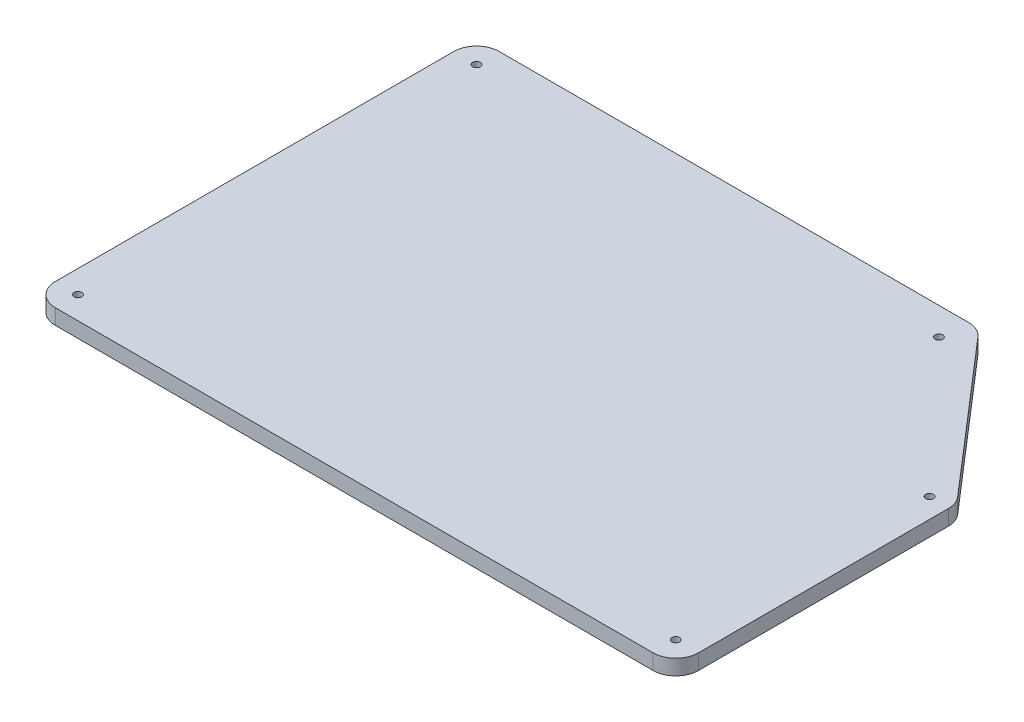
ISO-10303-21;
HEADER;
FILE_DESCRIPTION(('STEP AP214'),'2;1');
FILE_NAME('part.step','',(''),(''),'','','');
FILE_SCHEMA(('AUTOMOTIVE_DESIGN { 1 0 10303 214 1 1 1 1 }'));
ENDSEC;
DATA;
#1=APPLICATION_CONTEXT('core data for automotive mechanical design processes');
#2=APPLICATION_PROTOCOL_DEFINITION('international standard','automotive_design',2000,#1);
#3=PRODUCT_CONTEXT('',#1,'mechanical');
#4=PRODUCT('Part','Part','',(#3));
#5=PRODUCT_RELATED_PRODUCT_CATEGORY('part','',(#4));
#6=PRODUCT_DEFINITION_FORMATION('','',#4);
#7=PRODUCT_DEFINITION_CONTEXT('part definition',#1,'design');
#8=PRODUCT_DEFINITION('design','',#6,#7);
#9=PRODUCT_DEFINITION_SHAPE('','',#8);
#10=(LENGTH_UNIT() NAMED_UNIT(*) SI_UNIT(.MILLI.,.METRE.));
#11=(NAMED_UNIT(*) PLANE_ANGLE_UNIT() SI_UNIT($,.RADIAN.));
#12=(NAMED_UNIT(*) SI_UNIT($,.STERADIAN.) SOLID_ANGLE_UNIT());
#13=UNCERTAINTY_MEASURE_WITH_UNIT(LENGTH_MEASURE(1.E-05),#10,'distance_accuracy_value','');
#14=(GEOMETRIC_REPRESENTATION_CONTEXT(3) GLOBAL_UNCERTAINTY_ASSIGNED_CONTEXT((#13)) GLOBAL_UNIT_ASSIGNED_CONTEXT((#10,
#11,#12)) REPRESENTATION_CONTEXT('',''));
#15=CARTESIAN_POINT('',(0.,0.,0.));
#16=DIRECTION('',(0.,0.,1.));
#17=DIRECTION('',(1.,0.,0.));
#18=AXIS2_PLACEMENT_3D('',#15,#16,#17);
#19=CARTESIAN_POINT('',(83.2688303782972,5.,0.));
#20=DIRECTION('',(1.,0.,0.));
#21=DIRECTION('',(0.,0.,-1.));
#22=AXIS2_PLACEMENT_3D('',#19,#20,#21);
#23=PLANE('',#22);
#24=DIRECTION('',(0.,0.,1.));
#25=VECTOR('',#24,1.);
#26=CARTESIAN_POINT('',(83.2688303782972,0.,0.));
#27=LINE('',#26,#25);
#28=CARTESIAN_POINT('',(83.2688303782972,0.,-2.03159074727606));
#29=VERTEX_POINT('',#28);
#30=CARTESIAN_POINT('',(83.2688303782972,0.,79.4917752016495));
#31=VERTEX_POINT('',#30);
#32=EDGE_CURVE('E172',#29,#31,#27,.T.);
#33=ORIENTED_EDGE('',*,*,#32,.F.);
#34=DIRECTION('',(0.,-1.,0.));
#35=VECTOR('',#34,1.);
#36=CARTESIAN_POINT('',(83.2688303782972,5.,-2.03159074727606));
#37=LINE('',#36,#35);
#38=CARTESIAN_POINT('',(83.2688303782972,5.,-2.03159074727606));
#39=VERTEX_POINT('',#38);
#40=EDGE_CURVE('E11',#39,#29,#37,.T.);
#41=ORIENTED_EDGE('',*,*,#40,.F.);
#42=DIRECTION('',(0.,0.,1.));
#43=VECTOR('',#42,1.);
#44=CARTESIAN_POINT('',(83.2688303782972,5.,0.));
#45=LINE('',#44,#43);
#46=CARTESIAN_POINT('',(83.2688303782972,5.,79.4917752016495));
#47=VERTEX_POINT('',#46);
#48=EDGE_CURVE('E225',#39,#47,#45,.T.);
#49=ORIENTED_EDGE('',*,*,#48,.T.);
#50=DIRECTION('',(0.,-1.,0.));
#51=VECTOR('',#50,1.);
#52=CARTESIAN_POINT('',(83.2688303782972,5.,79.4917752016495));
#53=LINE('',#52,#51);
#54=EDGE_CURVE('E99',#47,#31,#53,.T.);
#55=ORIENTED_EDGE('',*,*,#54,.T.);
#56=EDGE_LOOP('',(#33,#41,#49,#55));
#57=FACE_BOUND('',#56,.T.);
#58=ADVANCED_FACE('F41',(#57),#23,.T.);
#59=CARTESIAN_POINT('',(75.8688303782972,5.,-2.03159074727606));
#60=DIRECTION('',(0.,-1.,0.));
#61=DIRECTION('',(0.,0.,-1.));
#62=AXIS2_PLACEMENT_3D('',#59,#60,#61);
#63=CYLINDRICAL_SURFACE('',#62,7.4);
#64=CARTESIAN_POINT('',(75.8688303782972,0.,-2.03159074727606));
#65=DIRECTION('',(0.,1.,0.));
#66=DIRECTION('',(0.,0.,1.));
#67=AXIS2_PLACEMENT_3D('',#64,#65,#66);
#68=CIRCLE('',#67,7.4);
#69=CARTESIAN_POINT('',(81.4699312593809,0.,-6.86767065975919));
#70=VERTEX_POINT('',#69);
#71=EDGE_CURVE('E176',#29,#70,#68,.T.);
#72=ORIENTED_EDGE('',*,*,#71,.T.);
#73=DIRECTION('',(0.,-1.,0.));
#74=VECTOR('',#73,1.);
#75=CARTESIAN_POINT('',(81.4699312593809,5.,-6.86767065975919));
#76=LINE('',#75,#74);
#77=CARTESIAN_POINT('',(81.4699312593809,5.,-6.86767065975919));
#78=VERTEX_POINT('',#77);
#79=EDGE_CURVE('E50',#78,#70,#76,.T.);
#80=ORIENTED_EDGE('',*,*,#79,.F.);
#81=CARTESIAN_POINT('',(75.8688303782972,5.,-2.03159074727606));
#82=DIRECTION('',(0.,1.,0.));
#83=DIRECTION('',(0.,0.,1.));
#84=AXIS2_PLACEMENT_3D('',#81,#82,#83);
#85=CIRCLE('',#84,7.4);
#86=EDGE_CURVE('E271',#39,#78,#85,.T.);
#87=ORIENTED_EDGE('',*,*,#86,.F.);
#88=ORIENTED_EDGE('',*,*,#40,.T.);
#89=EDGE_LOOP('',(#72,#80,#87,#88));
#90=FACE_BOUND('',#89,.T.);
#91=ADVANCED_FACE('F254',(#90),#63,.T.);
#92=CARTESIAN_POINT('',(50.0717458502195,5.,-43.2327446747138));
#93=DIRECTION('',(0.756905524470775,0.,-0.653524312497722));
#94=DIRECTION('',(-0.653524312497722,0.,-0.756905524470775));
#95=AXIS2_PLACEMENT_3D('',#92,#93,#94);
#96=PLANE('',#95);
#97=DIRECTION('',(0.653524312497722,0.,0.756905524470775));
#98=VECTOR('',#97,1.);
#99=CARTESIAN_POINT('',(50.0717458502195,0.,-43.2327446747138));
#100=LINE('',#99,#98);
#101=CARTESIAN_POINT('',(39.6144315752122,0.,-55.3443047108336));
#102=VERTEX_POINT('',#101);
#103=EDGE_CURVE('E180',#102,#70,#100,.T.);
#104=ORIENTED_EDGE('',*,*,#103,.F.);
#105=DIRECTION('',(0.,-1.,0.));
#106=VECTOR('',#105,1.);
#107=CARTESIAN_POINT('',(39.6144315752122,5.,-55.3443047108336));
#108=LINE('',#107,#106);
#109=CARTESIAN_POINT('',(39.6144315752122,5.,-55.3443047108336));
#110=VERTEX_POINT('',#109);
#111=EDGE_CURVE('E242',#110,#102,#108,.T.);
#112=ORIENTED_EDGE('',*,*,#111,.F.);
#113=DIRECTION('',(0.653524312497722,0.,0.756905524470775));
#114=VECTOR('',#113,1.);
#115=CARTESIAN_POINT('',(50.0717458502195,5.,-43.2327446747138));
#116=LINE('',#115,#114);
#117=EDGE_CURVE('E251',#110,#78,#116,.T.);
#118=ORIENTED_EDGE('',*,*,#117,.T.);
#119=ORIENTED_EDGE('',*,*,#79,.T.);
#120=EDGE_LOOP('',(#104,#112,#118,#119));
#121=FACE_BOUND('',#120,.T.);
#122=ADVANCED_FACE('F249',(#121),#96,.T.);
#123=CARTESIAN_POINT('',(34.0133306941285,5.,-50.5082247983504));
#124=DIRECTION('',(0.,-1.,0.));
#125=DIRECTION('',(0.,0.,-1.));
#126=AXIS2_PLACEMENT_3D('',#123,#124,#125);
#127=CYLINDRICAL_SURFACE('',#126,7.4);
#128=CARTESIAN_POINT('',(34.0133306941285,0.,-50.5082247983504));
#129=DIRECTION('',(0.,1.,0.));
#130=DIRECTION('',(0.,0.,1.));
#131=AXIS2_PLACEMENT_3D('',#128,#129,#130);
#132=CIRCLE('',#131,7.4);
#133=CARTESIAN_POINT('',(34.0133306941285,0.,-57.9082247983504));
#134=VERTEX_POINT('',#133);
#135=EDGE_CURVE('E184',#102,#134,#132,.T.);
#136=ORIENTED_EDGE('',*,*,#135,.T.);
#137=DIRECTION('',(0.,-1.,0.));
#138=VECTOR('',#137,1.);
#139=CARTESIAN_POINT('',(34.0133306941285,5.,-57.9082247983504));
#140=LINE('',#139,#138);
#141=CARTESIAN_POINT('',(34.0133306941285,5.,-57.9082247983504));
#142=VERTEX_POINT('',#141);
#143=EDGE_CURVE('E239',#142,#134,#140,.T.);
#144=ORIENTED_EDGE('',*,*,#143,.F.);
#145=CARTESIAN_POINT('',(34.0133306941285,5.,-50.5082247983504));
#146=DIRECTION('',(0.,1.,0.));
#147=DIRECTION('',(0.,0.,1.));
#148=AXIS2_PLACEMENT_3D('',#145,#146,#147);
#149=CIRCLE('',#148,7.4);
#150=EDGE_CURVE('E266',#110,#142,#149,.T.);
#151=ORIENTED_EDGE('',*,*,#150,.F.);
#152=ORIENTED_EDGE('',*,*,#111,.T.);
#153=EDGE_LOOP('',(#136,#144,#151,#152));
#154=FACE_BOUND('',#153,.T.);
#155=ADVANCED_FACE('F263',(#154),#127,.T.);
#156=CARTESIAN_POINT('',(0.,5.,-57.9082247983504));
#157=DIRECTION('',(0.,0.,-1.));
#158=DIRECTION('',(-1.,0.,0.));
#159=AXIS2_PLACEMENT_3D('',#156,#157,#158);
#160=PLANE('',#159);
#161=DIRECTION('',(1.,0.,0.));
#162=VECTOR('',#161,1.);
#163=CARTESIAN_POINT('',(0.,0.,-57.9082247983504));
#164=LINE('',#163,#162);
#165=CARTESIAN_POINT('',(-119.131169621703,0.,-57.9082247983504));
#166=VERTEX_POINT('',#165);
#167=EDGE_CURVE('E188',#166,#134,#164,.T.);
#168=ORIENTED_EDGE('',*,*,#167,.F.);
#169=DIRECTION('',(0.,-1.,0.));
#170=VECTOR('',#169,1.);
#171=CARTESIAN_POINT('',(-119.131169621703,5.,-57.9082247983504));
#172=LINE('',#171,#170);
#173=CARTESIAN_POINT('',(-119.131169621703,5.,-57.9082247983504));
#174=VERTEX_POINT('',#173);
#175=EDGE_CURVE('E236',#174,#166,#172,.T.);
#176=ORIENTED_EDGE('',*,*,#175,.F.);
#177=DIRECTION('',(1.,0.,0.));
#178=VECTOR('',#177,1.);
#179=CARTESIAN_POINT('',(0.,5.,-57.9082247983504));
#180=LINE('',#179,#178);
#181=EDGE_CURVE('E269',#174,#142,#180,.T.);
#182=ORIENTED_EDGE('',*,*,#181,.T.);
#183=ORIENTED_EDGE('',*,*,#143,.T.);
#184=EDGE_LOOP('',(#168,#176,#182,#183));
#185=FACE_BOUND('',#184,.T.);
#186=ADVANCED_FACE('F305',(#185),#160,.T.);
#187=CARTESIAN_POINT('',(-119.131169621703,5.,-50.5082247983504));
#188=DIRECTION('',(0.,-1.,0.));
#189=DIRECTION('',(0.,0.,-1.));
#190=AXIS2_PLACEMENT_3D('',#187,#188,#189);
#191=CYLINDRICAL_SURFACE('',#190,7.40000000000001);
#192=CARTESIAN_POINT('',(-119.131169621703,0.,-50.5082247983504));
#193=DIRECTION('',(0.,1.,0.));
#194=DIRECTION('',(0.,0.,1.));
#195=AXIS2_PLACEMENT_3D('',#192,#193,#194);
#196=CIRCLE('',#195,7.40000000000001);
#197=CARTESIAN_POINT('',(-126.531169621703,0.,-50.5082247983504));
#198=VERTEX_POINT('',#197);
#199=EDGE_CURVE('E192',#166,#198,#196,.T.);
#200=ORIENTED_EDGE('',*,*,#199,.T.);
#201=DIRECTION('',(0.,-1.,0.));
#202=VECTOR('',#201,1.);
#203=CARTESIAN_POINT('',(-126.531169621703,5.,-50.5082247983504));
#204=LINE('',#203,#202);
#205=CARTESIAN_POINT('',(-126.531169621703,5.,-50.5082247983504));
#206=VERTEX_POINT('',#205);
#207=EDGE_CURVE('E232',#206,#198,#204,.T.);
#208=ORIENTED_EDGE('',*,*,#207,.F.);
#209=CARTESIAN_POINT('',(-119.131169621703,5.,-50.5082247983504));
#210=DIRECTION('',(0.,1.,0.));
#211=DIRECTION('',(0.,0.,1.));
#212=AXIS2_PLACEMENT_3D('',#209,#210,#211);
#213=CIRCLE('',#212,7.40000000000001);
#214=EDGE_CURVE('E280',#174,#206,#213,.T.);
#215=ORIENTED_EDGE('',*,*,#214,.F.);
#216=ORIENTED_EDGE('',*,*,#175,.T.);
#217=EDGE_LOOP('',(#200,#208,#215,#216));
#218=FACE_BOUND('',#217,.T.);
#219=ADVANCED_FACE('F286',(#218),#191,.T.);
#220=CARTESIAN_POINT('',(-126.531169621703,5.,0.));
#221=DIRECTION('',(1.,0.,0.));
#222=DIRECTION('',(0.,0.,-1.));
#223=AXIS2_PLACEMENT_3D('',#220,#221,#222);
#224=PLANE('',#223);
#225=DIRECTION('',(0.,0.,1.));
#226=VECTOR('',#225,1.);
#227=CARTESIAN_POINT('',(-126.531169621703,0.,0.));
#228=LINE('',#227,#226);
#229=CARTESIAN_POINT('',(-126.531169621703,0.,79.4917752016495));
#230=VERTEX_POINT('',#229);
#231=EDGE_CURVE('E195',#198,#230,#228,.T.);
#232=ORIENTED_EDGE('',*,*,#231,.T.);
#233=DIRECTION('',(0.,-1.,0.));
#234=VECTOR('',#233,1.);
#235=CARTESIAN_POINT('',(-126.531169621703,5.,79.4917752016495));
#236=LINE('',#235,#234);
#237=CARTESIAN_POINT('',(-126.531169621703,5.,79.4917752016495));
#238=VERTEX_POINT('',#237);
#239=EDGE_CURVE('E142',#238,#230,#236,.T.);
#240=ORIENTED_EDGE('',*,*,#239,.F.);
#241=DIRECTION('',(0.,0.,1.));
#242=VECTOR('',#241,1.);
#243=CARTESIAN_POINT('',(-126.531169621703,5.,0.));
#244=LINE('',#243,#242);
#245=EDGE_CURVE('E131',#206,#238,#244,.T.);
#246=ORIENTED_EDGE('',*,*,#245,.F.);
#247=ORIENTED_EDGE('',*,*,#207,.T.);
#248=EDGE_LOOP('',(#232,#240,#246,#247));
#249=FACE_BOUND('',#248,.T.);
#250=ADVANCED_FACE('F289',(#249),#224,.F.);
#251=CARTESIAN_POINT('',(-119.131169621703,5.,79.4917752016495));
#252=DIRECTION('',(0.,-1.,0.));
#253=DIRECTION('',(0.,0.,-1.));
#254=AXIS2_PLACEMENT_3D('',#251,#252,#253);
#255=CYLINDRICAL_SURFACE('',#254,7.4);
#256=CARTESIAN_POINT('',(-119.131169621703,0.,79.4917752016495));
#257=DIRECTION('',(0.,1.,0.));
#258=DIRECTION('',(0.,0.,1.));
#259=AXIS2_PLACEMENT_3D('',#256,#257,#258);
#260=CIRCLE('',#259,7.4);
#261=CARTESIAN_POINT('',(-119.131169621703,0.,86.8917752016496));
#262=VERTEX_POINT('',#261);
#263=EDGE_CURVE('E140',#230,#262,#260,.T.);
#264=ORIENTED_EDGE('',*,*,#263,.T.);
#265=DIRECTION('',(0.,-1.,0.));
#266=VECTOR('',#265,1.);
#267=CARTESIAN_POINT('',(-119.131169621703,5.,86.8917752016496));
#268=LINE('',#267,#266);
#269=CARTESIAN_POINT('',(-119.131169621703,5.,86.8917752016496));
#270=VERTEX_POINT('',#269);
#271=EDGE_CURVE('E137',#270,#262,#268,.T.);
#272=ORIENTED_EDGE('',*,*,#271,.F.);
#273=CARTESIAN_POINT('',(-119.131169621703,5.,79.4917752016495));
#274=DIRECTION('',(0.,1.,0.));
#275=DIRECTION('',(0.,0.,1.));
#276=AXIS2_PLACEMENT_3D('',#273,#274,#275);
#277=CIRCLE('',#276,7.4);
#278=EDGE_CURVE('E124',#238,#270,#277,.T.);
#279=ORIENTED_EDGE('',*,*,#278,.F.);
#280=ORIENTED_EDGE('',*,*,#239,.T.);
#281=EDGE_LOOP('',(#264,#272,#279,#280));
#282=FACE_BOUND('',#281,.T.);
#283=ADVANCED_FACE('F138',(#282),#255,.T.);
#284=CARTESIAN_POINT('',(0.,5.,86.8917752016496));
#285=DIRECTION('',(0.,0.,-1.));
#286=DIRECTION('',(-1.,0.,0.));
#287=AXIS2_PLACEMENT_3D('',#284,#285,#286);
#288=PLANE('',#287);
#289=DIRECTION('',(1.,0.,0.));
#290=VECTOR('',#289,1.);
#291=CARTESIAN_POINT('',(0.,0.,86.8917752016496));
#292=LINE('',#291,#290);
#293=CARTESIAN_POINT('',(75.8688303782972,0.,86.8917752016496));
#294=VERTEX_POINT('',#293);
#295=EDGE_CURVE('E92',#262,#294,#292,.T.);
#296=ORIENTED_EDGE('',*,*,#295,.T.);
#297=DIRECTION('',(0.,-1.,0.));
#298=VECTOR('',#297,1.);
#299=CARTESIAN_POINT('',(75.8688303782972,5.,86.8917752016496));
#300=LINE('',#299,#298);
#301=CARTESIAN_POINT('',(75.8688303782972,5.,86.8917752016496));
#302=VERTEX_POINT('',#301);
#303=EDGE_CURVE('E143',#302,#294,#300,.T.);
#304=ORIENTED_EDGE('',*,*,#303,.F.);
#305=DIRECTION('',(1.,0.,0.));
#306=VECTOR('',#305,1.);
#307=CARTESIAN_POINT('',(0.,5.,86.8917752016496));
#308=LINE('',#307,#306);
#309=EDGE_CURVE('E129',#270,#302,#308,.T.);
#310=ORIENTED_EDGE('',*,*,#309,.F.);
#311=ORIENTED_EDGE('',*,*,#271,.T.);
#312=EDGE_LOOP('',(#296,#304,#310,#311));
#313=FACE_BOUND('',#312,.T.);
#314=ADVANCED_FACE('F145',(#313),#288,.F.);
#315=CARTESIAN_POINT('',(33.2914196315731,5.,-48.93114885584));
#316=DIRECTION('',(0.,-1.,0.));
#317=DIRECTION('',(0.,0.,-1.));
#318=AXIS2_PLACEMENT_3D('',#315,#316,#317);
#319=CYLINDRICAL_SURFACE('',#318,1.25);
#320=CARTESIAN_POINT('',(33.2914196315731,5.,-48.93114885584));
#321=DIRECTION('',(0.,1.,0.));
#322=DIRECTION('',(0.,0.,1.));
#323=AXIS2_PLACEMENT_3D('',#320,#321,#322);
#324=CIRCLE('',#323,1.25);
#325=CARTESIAN_POINT('',(33.2914196315731,5.,-47.68114885584));
#326=VERTEX_POINT('',#325);
#327=EDGE_CURVE('E164',#326,#326,#324,.T.);
#328=ORIENTED_EDGE('',*,*,#327,.T.);
#329=EDGE_LOOP('',(#328));
#330=FACE_BOUND('',#329,.T.);
#331=CARTESIAN_POINT('',(33.2914196315731,0.,-48.93114885584));
#332=DIRECTION('',(0.,1.,0.));
#333=DIRECTION('',(0.,0.,1.));
#334=AXIS2_PLACEMENT_3D('',#331,#332,#333);
#335=CIRCLE('',#334,1.25);
#336=CARTESIAN_POINT('',(33.2914196315731,0.,-47.68114885584));
#337=VERTEX_POINT('',#336);
#338=EDGE_CURVE('E217',#337,#337,#335,.T.);
#339=ORIENTED_EDGE('',*,*,#338,.F.);
#340=EDGE_LOOP('',(#339));
#341=FACE_BOUND('',#340,.T.);
#342=ADVANCED_FACE('F317',(#330,#341),#319,.F.);
#343=CARTESIAN_POINT('',(-119.131169621703,5.,-50.5082247983504));
#344=DIRECTION('',(0.,-1.,0.));
#345=DIRECTION('',(0.,0.,-1.));
#346=AXIS2_PLACEMENT_3D('',#343,#344,#345);
#347=CYLINDRICAL_SURFACE('',#346,1.24999999999998);
#348=CARTESIAN_POINT('',(-119.131169621703,5.,-50.5082247983504));
#349=DIRECTION('',(0.,1.,0.));
#350=DIRECTION('',(0.,0.,1.));
#351=AXIS2_PLACEMENT_3D('',#348,#349,#350);
#352=CIRCLE('',#351,1.24999999999998);
#353=CARTESIAN_POINT('',(-119.131169621703,5.,-49.2582247983504));
#354=VERTEX_POINT('',#353);
#355=EDGE_CURVE('E160',#354,#354,#352,.T.);
#356=ORIENTED_EDGE('',*,*,#355,.T.);
#357=EDGE_LOOP('',(#356));
#358=FACE_BOUND('',#357,.T.);
#359=CARTESIAN_POINT('',(-119.131169621703,0.,-50.5082247983504));
#360=DIRECTION('',(0.,1.,0.));
#361=DIRECTION('',(0.,0.,1.));
#362=AXIS2_PLACEMENT_3D('',#359,#360,#361);
#363=CIRCLE('',#362,1.24999999999998);
#364=CARTESIAN_POINT('',(-119.131169621703,0.,-49.2582247983504));
#365=VERTEX_POINT('',#364);
#366=EDGE_CURVE('E213',#365,#365,#363,.T.);
#367=ORIENTED_EDGE('',*,*,#366,.F.);
#368=EDGE_LOOP('',(#367));
#369=FACE_BOUND('',#368,.T.);
#370=ADVANCED_FACE('F328',(#358,#369),#347,.F.);
#371=CARTESIAN_POINT('',(-119.131169621703,5.,79.4917752016495));
#372=DIRECTION('',(0.,-1.,0.));
#373=DIRECTION('',(0.,0.,-1.));
#374=AXIS2_PLACEMENT_3D('',#371,#372,#373);
#375=CYLINDRICAL_SURFACE('',#374,1.24999999999998);
#376=CARTESIAN_POINT('',(-119.131169621703,5.,79.4917752016495));
#377=DIRECTION('',(0.,1.,0.));
#378=DIRECTION('',(0.,0.,1.));
#379=AXIS2_PLACEMENT_3D('',#376,#377,#378);
#380=CIRCLE('',#379,1.24999999999998);
#381=CARTESIAN_POINT('',(-119.131169621703,5.,80.7417752016495));
#382=VERTEX_POINT('',#381);
#383=EDGE_CURVE('E156',#382,#382,#380,.T.);
#384=ORIENTED_EDGE('',*,*,#383,.T.);
#385=EDGE_LOOP('',(#384));
#386=FACE_BOUND('',#385,.T.);
#387=CARTESIAN_POINT('',(-119.131169621703,0.,79.4917752016495));
#388=DIRECTION('',(0.,1.,0.));
#389=DIRECTION('',(0.,0.,1.));
#390=AXIS2_PLACEMENT_3D('',#387,#388,#389);
#391=CIRCLE('',#390,1.24999999999998);
#392=CARTESIAN_POINT('',(-119.131169621703,0.,80.7417752016495));
#393=VERTEX_POINT('',#392);
#394=EDGE_CURVE('E209',#393,#393,#391,.T.);
#395=ORIENTED_EDGE('',*,*,#394,.F.);
#396=EDGE_LOOP('',(#395));
#397=FACE_BOUND('',#396,.T.);
#398=ADVANCED_FACE('F324',(#386,#397),#375,.F.);
#399=CARTESIAN_POINT('',(75.8688303782972,5.,79.4917752016495));
#400=DIRECTION('',(0.,-1.,0.));
#401=DIRECTION('',(0.,0.,-1.));
#402=AXIS2_PLACEMENT_3D('',#399,#400,#401);
#403=CYLINDRICAL_SURFACE('',#402,1.24999999999998);
#404=CARTESIAN_POINT('',(75.8688303782972,5.,79.4917752016495));
#405=DIRECTION('',(0.,1.,0.));
#406=DIRECTION('',(0.,0.,1.));
#407=AXIS2_PLACEMENT_3D('',#404,#405,#406);
#408=CIRCLE('',#407,1.24999999999998);
#409=CARTESIAN_POINT('',(75.8688303782972,5.,80.7417752016495));
#410=VERTEX_POINT('',#409);
#411=EDGE_CURVE('E149',#410,#410,#408,.T.);
#412=ORIENTED_EDGE('',*,*,#411,.T.);
#413=EDGE_LOOP('',(#412));
#414=FACE_BOUND('',#413,.T.);
#415=CARTESIAN_POINT('',(75.8688303782972,0.,79.4917752016495));
#416=DIRECTION('',(0.,1.,0.));
#417=DIRECTION('',(0.,0.,1.));
#418=AXIS2_PLACEMENT_3D('',#415,#416,#417);
#419=CIRCLE('',#418,1.24999999999998);
#420=CARTESIAN_POINT('',(75.8688303782972,0.,80.7417752016495));
#421=VERTEX_POINT('',#420);
#422=EDGE_CURVE('E205',#421,#421,#419,.T.);
#423=ORIENTED_EDGE('',*,*,#422,.F.);
#424=EDGE_LOOP('',(#423));
#425=FACE_BOUND('',#424,.T.);
#426=ADVANCED_FACE('F321',(#414,#425),#403,.F.);
#427=CARTESIAN_POINT('',(75.8688303782972,5.,79.4917752016495));
#428=DIRECTION('',(0.,-1.,0.));
#429=DIRECTION('',(0.,0.,-1.));
#430=AXIS2_PLACEMENT_3D('',#427,#428,#429);
#431=CYLINDRICAL_SURFACE('',#430,7.4);
#432=CARTESIAN_POINT('',(75.8688303782972,0.,79.4917752016495));
#433=DIRECTION('',(0.,1.,0.));
#434=DIRECTION('',(0.,0.,1.));
#435=AXIS2_PLACEMENT_3D('',#432,#433,#434);
#436=CIRCLE('',#435,7.4);
#437=EDGE_CURVE('E202',#294,#31,#436,.T.);
#438=ORIENTED_EDGE('',*,*,#437,.T.);
#439=ORIENTED_EDGE('',*,*,#54,.F.);
#440=CARTESIAN_POINT('',(75.8688303782972,5.,79.4917752016495));
#441=DIRECTION('',(0.,1.,0.));
#442=DIRECTION('',(0.,0.,1.));
#443=AXIS2_PLACEMENT_3D('',#440,#441,#442);
#444=CIRCLE('',#443,7.4);
#445=EDGE_CURVE('E58',#302,#47,#444,.T.);
#446=ORIENTED_EDGE('',*,*,#445,.F.);
#447=ORIENTED_EDGE('',*,*,#303,.T.);
#448=EDGE_LOOP('',(#438,#439,#446,#447));
#449=FACE_BOUND('',#448,.T.);
#450=ADVANCED_FACE('F292',(#449),#431,.T.);
#451=CARTESIAN_POINT('',(76.8106066892351,5.,-2.38190765820812));
#452=DIRECTION('',(0.,-1.,0.));
#453=DIRECTION('',(0.,0.,-1.));
#454=AXIS2_PLACEMENT_3D('',#451,#452,#453);
#455=CYLINDRICAL_SURFACE('',#454,1.24999999999998);
#456=CARTESIAN_POINT('',(76.8106066892351,5.,-2.38190765820812));
#457=DIRECTION('',(0.,1.,0.));
#458=DIRECTION('',(0.,0.,1.));
#459=AXIS2_PLACEMENT_3D('',#456,#457,#458);
#460=CIRCLE('',#459,1.24999999999998);
#461=CARTESIAN_POINT('',(76.8106066892351,5.,-1.13190765820813));
#462=VERTEX_POINT('',#461);
#463=EDGE_CURVE('E168',#462,#462,#460,.T.);
#464=ORIENTED_EDGE('',*,*,#463,.T.);
#465=EDGE_LOOP('',(#464));
#466=FACE_BOUND('',#465,.T.);
#467=CARTESIAN_POINT('',(76.8106066892351,0.,-2.38190765820812));
#468=DIRECTION('',(0.,1.,0.));
#469=DIRECTION('',(0.,0.,1.));
#470=AXIS2_PLACEMENT_3D('',#467,#468,#469);
#471=CIRCLE('',#470,1.24999999999998);
#472=CARTESIAN_POINT('',(76.8106066892351,0.,-1.13190765820813));
#473=VERTEX_POINT('',#472);
#474=EDGE_CURVE('E221',#473,#473,#471,.T.);
#475=ORIENTED_EDGE('',*,*,#474,.F.);
#476=EDGE_LOOP('',(#475));
#477=FACE_BOUND('',#476,.T.);
#478=ADVANCED_FACE('F320',(#466,#477),#455,.F.);
#479=CARTESIAN_POINT('',(0.,5.,0.));
#480=DIRECTION('',(0.,1.,0.));
#481=DIRECTION('',(0.,0.,1.));
#482=AXIS2_PLACEMENT_3D('',#479,#480,#481);
#483=PLANE('',#482);
#484=ORIENTED_EDGE('',*,*,#48,.F.);
#485=ORIENTED_EDGE('',*,*,#86,.T.);
#486=ORIENTED_EDGE('',*,*,#117,.F.);
#487=ORIENTED_EDGE('',*,*,#150,.T.);
#488=ORIENTED_EDGE('',*,*,#181,.F.);
#489=ORIENTED_EDGE('',*,*,#214,.T.);
#490=ORIENTED_EDGE('',*,*,#245,.T.);
#491=ORIENTED_EDGE('',*,*,#278,.T.);
#492=ORIENTED_EDGE('',*,*,#309,.T.);
#493=ORIENTED_EDGE('',*,*,#445,.T.);
#494=EDGE_LOOP('',(#484,#485,#486,#487,#488,#489,#490,#491,#492,#493));
#495=FACE_BOUND('',#494,.T.);
#496=ORIENTED_EDGE('',*,*,#411,.F.);
#497=EDGE_LOOP('',(#496));
#498=FACE_BOUND('',#497,.T.);
#499=ORIENTED_EDGE('',*,*,#383,.F.);
#500=EDGE_LOOP('',(#499));
#501=FACE_BOUND('',#500,.T.);
#502=ORIENTED_EDGE('',*,*,#355,.F.);
#503=EDGE_LOOP('',(#502));
#504=FACE_BOUND('',#503,.T.);
#505=ORIENTED_EDGE('',*,*,#327,.F.);
#506=EDGE_LOOP('',(#505));
#507=FACE_BOUND('',#506,.T.);
#508=ORIENTED_EDGE('',*,*,#463,.F.);
#509=EDGE_LOOP('',(#508));
#510=FACE_BOUND('',#509,.T.);
#511=ADVANCED_FACE('F126',(#495,#498,#501,#504,#507,#510),#483,.T.);
#512=CARTESIAN_POINT('',(0.,0.,0.));
#513=DIRECTION('',(0.,1.,0.));
#514=DIRECTION('',(0.,0.,1.));
#515=AXIS2_PLACEMENT_3D('',#512,#513,#514);
#516=PLANE('',#515);
#517=ORIENTED_EDGE('',*,*,#32,.T.);
#518=ORIENTED_EDGE('',*,*,#437,.F.);
#519=ORIENTED_EDGE('',*,*,#295,.F.);
#520=ORIENTED_EDGE('',*,*,#263,.F.);
#521=ORIENTED_EDGE('',*,*,#231,.F.);
#522=ORIENTED_EDGE('',*,*,#199,.F.);
#523=ORIENTED_EDGE('',*,*,#167,.T.);
#524=ORIENTED_EDGE('',*,*,#135,.F.);
#525=ORIENTED_EDGE('',*,*,#103,.T.);
#526=ORIENTED_EDGE('',*,*,#71,.F.);
#527=EDGE_LOOP('',(#517,#518,#519,#520,#521,#522,#523,#524,#525,#526));
#528=FACE_BOUND('',#527,.T.);
#529=ORIENTED_EDGE('',*,*,#422,.T.);
#530=EDGE_LOOP('',(#529));
#531=FACE_BOUND('',#530,.T.);
#532=ORIENTED_EDGE('',*,*,#394,.T.);
#533=EDGE_LOOP('',(#532));
#534=FACE_BOUND('',#533,.T.);
#535=ORIENTED_EDGE('',*,*,#366,.T.);
#536=EDGE_LOOP('',(#535));
#537=FACE_BOUND('',#536,.T.);
#538=ORIENTED_EDGE('',*,*,#338,.T.);
#539=EDGE_LOOP('',(#538));
#540=FACE_BOUND('',#539,.T.);
#541=ORIENTED_EDGE('',*,*,#474,.T.);
#542=EDGE_LOOP('',(#541));
#543=FACE_BOUND('',#542,.T.);
#544=ADVANCED_FACE('F257',(#528,#531,#534,#537,#540,#543),#516,.F.);
#545=CLOSED_SHELL('',(#58,#91,#122,#155,#186,#219,#250,#283,#314,#342,#370,#398,#426,#450,#478,
#511,#544));
#546=MANIFOLD_SOLID_BREP('B2',#545);
#547=ADVANCED_BREP_SHAPE_REPRESENTATION('',(#18,#546),#14);
#548=SHAPE_DEFINITION_REPRESENTATION(#9,#547);
ENDSEC;
END-ISO-10303-21;
